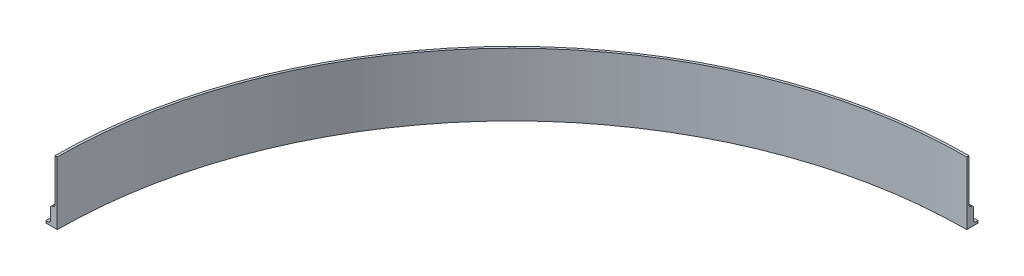
ISO-10303-21;
HEADER;
FILE_DESCRIPTION(('STEP AP214'),'2;1');
FILE_NAME('part.step','',(''),(''),'','','');
FILE_SCHEMA(('AUTOMOTIVE_DESIGN { 1 0 10303 214 1 1 1 1 }'));
ENDSEC;
DATA;
#1=APPLICATION_CONTEXT('core data for automotive mechanical design processes');
#2=APPLICATION_PROTOCOL_DEFINITION('international standard','automotive_design',2000,#1);
#3=PRODUCT_CONTEXT('',#1,'mechanical');
#4=PRODUCT('Part','Part','',(#3));
#5=PRODUCT_RELATED_PRODUCT_CATEGORY('part','',(#4));
#6=PRODUCT_DEFINITION_FORMATION('','',#4);
#7=PRODUCT_DEFINITION_CONTEXT('part definition',#1,'design');
#8=PRODUCT_DEFINITION('design','',#6,#7);
#9=PRODUCT_DEFINITION_SHAPE('','',#8);
#10=(LENGTH_UNIT() NAMED_UNIT(*) SI_UNIT(.MILLI.,.METRE.));
#11=(NAMED_UNIT(*) PLANE_ANGLE_UNIT() SI_UNIT($,.RADIAN.));
#12=(NAMED_UNIT(*) SI_UNIT($,.STERADIAN.) SOLID_ANGLE_UNIT());
#13=UNCERTAINTY_MEASURE_WITH_UNIT(LENGTH_MEASURE(1.E-05),#10,'distance_accuracy_value','');
#14=(GEOMETRIC_REPRESENTATION_CONTEXT(3) GLOBAL_UNCERTAINTY_ASSIGNED_CONTEXT((#13)) GLOBAL_UNIT_ASSIGNED_CONTEXT((#10,
#11,#12)) REPRESENTATION_CONTEXT('',''));
#15=CARTESIAN_POINT('',(0.,0.,0.));
#16=DIRECTION('',(0.,0.,1.));
#17=DIRECTION('',(1.,0.,0.));
#18=AXIS2_PLACEMENT_3D('',#15,#16,#17);
#19=CARTESIAN_POINT('',(1036.,5.,0.));
#20=DIRECTION('',(0.,-1.,0.));
#21=DIRECTION('',(0.,0.,-1.));
#22=AXIS2_PLACEMENT_3D('',#19,#20,#21);
#23=CYLINDRICAL_SURFACE('',#22,1036.);
#24=CARTESIAN_POINT('',(1036.,0.,0.));
#25=DIRECTION('',(0.,1.,0.));
#26=DIRECTION('',(0.,0.,-1.));
#27=AXIS2_PLACEMENT_3D('',#24,#25,#26);
#28=CIRCLE('',#27,1036.);
#29=CARTESIAN_POINT('',(1036.,0.,-1036.));
#30=VERTEX_POINT('',#29);
#31=CARTESIAN_POINT('',(0.,0.,0.));
#32=VERTEX_POINT('',#31);
#33=EDGE_CURVE('E152',#30,#32,#28,.T.);
#34=ORIENTED_EDGE('',*,*,#33,.T.);
#35=DIRECTION('',(0.,-1.,0.));
#36=VECTOR('',#35,1.);
#37=CARTESIAN_POINT('',(0.,5.,0.));
#38=LINE('',#37,#36);
#39=CARTESIAN_POINT('',(0.,5.,0.));
#40=VERTEX_POINT('',#39);
#41=EDGE_CURVE('E170',#40,#32,#38,.T.);
#42=ORIENTED_EDGE('',*,*,#41,.F.);
#43=CARTESIAN_POINT('',(1036.,5.,0.));
#44=DIRECTION('',(0.,1.,0.));
#45=DIRECTION('',(0.,0.,-1.));
#46=AXIS2_PLACEMENT_3D('',#43,#44,#45);
#47=CIRCLE('',#46,1036.);
#48=CARTESIAN_POINT('',(1036.,5.,-1036.));
#49=VERTEX_POINT('',#48);
#50=EDGE_CURVE('E153',#49,#40,#47,.T.);
#51=ORIENTED_EDGE('',*,*,#50,.F.);
#52=DIRECTION('',(0.,-1.,0.));
#53=VECTOR('',#52,1.);
#54=CARTESIAN_POINT('',(1036.,5.,-1036.));
#55=LINE('',#54,#53);
#56=EDGE_CURVE('E122',#49,#30,#55,.T.);
#57=ORIENTED_EDGE('',*,*,#56,.T.);
#58=EDGE_LOOP('',(#34,#42,#51,#57));
#59=FACE_BOUND('',#58,.T.);
#60=ADVANCED_FACE('F33',(#59),#23,.T.);
#61=CARTESIAN_POINT('',(0.,5.,0.));
#62=DIRECTION('',(0.,0.,-1.));
#63=DIRECTION('',(-1.,0.,0.));
#64=AXIS2_PLACEMENT_3D('',#61,#62,#63);
#65=PLANE('',#64);
#66=DIRECTION('',(0.,-1.,0.));
#67=VECTOR('',#66,1.);
#68=CARTESIAN_POINT('',(20.,140.,-1.86636172190057E-13));
#69=LINE('',#68,#67);
#70=CARTESIAN_POINT('',(20.,140.,-1.86636172190057E-13));
#71=VERTEX_POINT('',#70);
#72=CARTESIAN_POINT('',(20.,45.,-1.86636172190057E-13));
#73=VERTEX_POINT('',#72);
#74=EDGE_CURVE('E142',#71,#73,#69,.T.);
#75=ORIENTED_EDGE('',*,*,#74,.T.);
#76=CARTESIAN_POINT('',(15.0000000000001,45.,0.));
#77=DIRECTION('',(0.,0.,-1.));
#78=DIRECTION('',(-1.,0.,0.));
#79=AXIS2_PLACEMENT_3D('',#76,#77,#78);
#80=CIRCLE('',#79,5.);
#81=CARTESIAN_POINT('',(14.9999999999999,40.,0.));
#82=VERTEX_POINT('',#81);
#83=EDGE_CURVE('E185',#73,#82,#80,.T.);
#84=ORIENTED_EDGE('',*,*,#83,.T.);
#85=CARTESIAN_POINT('',(14.9999999999999,35.,0.));
#86=DIRECTION('',(0.,0.,-1.));
#87=DIRECTION('',(-1.,0.,0.));
#88=AXIS2_PLACEMENT_3D('',#85,#86,#87);
#89=CIRCLE('',#88,5.);
#90=CARTESIAN_POINT('',(10.,35.,-1.88473142388778E-13));
#91=VERTEX_POINT('',#90);
#92=EDGE_CURVE('E176',#82,#91,#89,.F.);
#93=ORIENTED_EDGE('',*,*,#92,.T.);
#94=DIRECTION('',(0.,-1.,0.));
#95=VECTOR('',#94,1.);
#96=CARTESIAN_POINT('',(10.,40.,-1.88473142388778E-13));
#97=LINE('',#96,#95);
#98=CARTESIAN_POINT('',(10.,10.,-1.88473142388778E-13));
#99=VERTEX_POINT('',#98);
#100=EDGE_CURVE('E146',#91,#99,#97,.T.);
#101=ORIENTED_EDGE('',*,*,#100,.T.);
#102=CARTESIAN_POINT('',(5.00000000000012,10.,0.));
#103=DIRECTION('',(0.,0.,-1.));
#104=DIRECTION('',(-1.,0.,0.));
#105=AXIS2_PLACEMENT_3D('',#102,#103,#104);
#106=CIRCLE('',#105,5.);
#107=CARTESIAN_POINT('',(5.00000000000012,5.,0.));
#108=VERTEX_POINT('',#107);
#109=EDGE_CURVE('E42',#99,#108,#106,.T.);
#110=ORIENTED_EDGE('',*,*,#109,.T.);
#111=DIRECTION('',(1.,0.,0.));
#112=VECTOR('',#111,1.);
#113=CARTESIAN_POINT('',(0.,5.,0.));
#114=LINE('',#113,#112);
#115=EDGE_CURVE('E156',#40,#108,#114,.T.);
#116=ORIENTED_EDGE('',*,*,#115,.F.);
#117=ORIENTED_EDGE('',*,*,#41,.T.);
#118=DIRECTION('',(1.,0.,0.));
#119=VECTOR('',#118,1.);
#120=CARTESIAN_POINT('',(0.,0.,0.));
#121=LINE('',#120,#119);
#122=CARTESIAN_POINT('',(24.9999999999999,0.,0.));
#123=VERTEX_POINT('',#122);
#124=EDGE_CURVE('E163',#32,#123,#121,.T.);
#125=ORIENTED_EDGE('',*,*,#124,.T.);
#126=DIRECTION('',(0.,-1.,0.));
#127=VECTOR('',#126,1.);
#128=CARTESIAN_POINT('',(24.9999999999999,5.,0.));
#129=LINE('',#128,#127);
#130=CARTESIAN_POINT('',(24.9999999999999,140.,0.));
#131=VERTEX_POINT('',#130);
#132=EDGE_CURVE('E121',#131,#123,#129,.T.);
#133=ORIENTED_EDGE('',*,*,#132,.F.);
#134=DIRECTION('',(1.,0.,0.));
#135=VECTOR('',#134,1.);
#136=CARTESIAN_POINT('',(20.,140.,-1.24424114793371E-13));
#137=LINE('',#136,#135);
#138=EDGE_CURVE('E136',#71,#131,#137,.T.);
#139=ORIENTED_EDGE('',*,*,#138,.F.);
#140=EDGE_LOOP('',(#75,#84,#93,#101,#110,#116,#117,#125,#133,#139));
#141=FACE_BOUND('',#140,.T.);
#142=ADVANCED_FACE('F190',(#141),#65,.F.);
#143=CARTESIAN_POINT('',(1036.,5.,0.));
#144=DIRECTION('',(0.,-1.,0.));
#145=DIRECTION('',(0.,0.,-1.));
#146=AXIS2_PLACEMENT_3D('',#143,#144,#145);
#147=CYLINDRICAL_SURFACE('',#146,1011.);
#148=CARTESIAN_POINT('',(1036.,0.,0.));
#149=DIRECTION('',(0.,-1.,0.));
#150=DIRECTION('',(0.,0.,-1.));
#151=AXIS2_PLACEMENT_3D('',#148,#149,#150);
#152=CIRCLE('',#151,1011.);
#153=CARTESIAN_POINT('',(1036.,0.,-1011.));
#154=VERTEX_POINT('',#153);
#155=EDGE_CURVE('E119',#123,#154,#152,.T.);
#156=ORIENTED_EDGE('',*,*,#155,.T.);
#157=DIRECTION('',(0.,-1.,0.));
#158=VECTOR('',#157,1.);
#159=CARTESIAN_POINT('',(1036.,5.,-1011.));
#160=LINE('',#159,#158);
#161=CARTESIAN_POINT('',(1036.,140.,-1011.));
#162=VERTEX_POINT('',#161);
#163=EDGE_CURVE('E112',#162,#154,#160,.T.);
#164=ORIENTED_EDGE('',*,*,#163,.F.);
#165=CARTESIAN_POINT('',(1036.,140.,0.));
#166=DIRECTION('',(0.,-1.,0.));
#167=DIRECTION('',(0.,0.,1.));
#168=AXIS2_PLACEMENT_3D('',#165,#166,#167);
#169=CIRCLE('',#168,1011.);
#170=EDGE_CURVE('E117',#131,#162,#169,.T.);
#171=ORIENTED_EDGE('',*,*,#170,.F.);
#172=ORIENTED_EDGE('',*,*,#132,.T.);
#173=EDGE_LOOP('',(#156,#164,#171,#172));
#174=FACE_BOUND('',#173,.T.);
#175=ADVANCED_FACE('F114',(#174),#147,.F.);
#176=CARTESIAN_POINT('',(1036.,5.,-1036.));
#177=DIRECTION('',(-1.,0.,0.));
#178=DIRECTION('',(0.,0.,1.));
#179=AXIS2_PLACEMENT_3D('',#176,#177,#178);
#180=PLANE('',#179);
#181=DIRECTION('',(0.,-1.,0.));
#182=VECTOR('',#181,1.);
#183=CARTESIAN_POINT('',(1036.,40.,-1026.));
#184=LINE('',#183,#182);
#185=CARTESIAN_POINT('',(1036.,35.,-1026.));
#186=VERTEX_POINT('',#185);
#187=CARTESIAN_POINT('',(1036.,10.,-1026.));
#188=VERTEX_POINT('',#187);
#189=EDGE_CURVE('E149',#186,#188,#184,.T.);
#190=ORIENTED_EDGE('',*,*,#189,.F.);
#191=CARTESIAN_POINT('',(1035.99999999999,35.,-1021.));
#192=DIRECTION('',(-1.,0.,0.));
#193=DIRECTION('',(0.,0.,1.));
#194=AXIS2_PLACEMENT_3D('',#191,#192,#193);
#195=CIRCLE('',#194,5.);
#196=CARTESIAN_POINT('',(1036.,40.,-1021.));
#197=VERTEX_POINT('',#196);
#198=EDGE_CURVE('E49',#186,#197,#195,.F.);
#199=ORIENTED_EDGE('',*,*,#198,.T.);
#200=CARTESIAN_POINT('',(1035.99999999999,45.,-1021.));
#201=DIRECTION('',(-1.,0.,0.));
#202=DIRECTION('',(0.,0.,1.));
#203=AXIS2_PLACEMENT_3D('',#200,#201,#202);
#204=CIRCLE('',#203,5.);
#205=CARTESIAN_POINT('',(1036.,45.,-1016.));
#206=VERTEX_POINT('',#205);
#207=EDGE_CURVE('E187',#197,#206,#204,.T.);
#208=ORIENTED_EDGE('',*,*,#207,.T.);
#209=DIRECTION('',(0.,-1.,0.));
#210=VECTOR('',#209,1.);
#211=CARTESIAN_POINT('',(1036.,140.,-1016.));
#212=LINE('',#211,#210);
#213=CARTESIAN_POINT('',(1036.,140.,-1016.));
#214=VERTEX_POINT('',#213);
#215=EDGE_CURVE('E128',#214,#206,#212,.T.);
#216=ORIENTED_EDGE('',*,*,#215,.F.);
#217=DIRECTION('',(0.,0.,-1.));
#218=VECTOR('',#217,1.);
#219=CARTESIAN_POINT('',(1036.,140.,-1016.));
#220=LINE('',#219,#218);
#221=EDGE_CURVE('E125',#162,#214,#220,.T.);
#222=ORIENTED_EDGE('',*,*,#221,.F.);
#223=ORIENTED_EDGE('',*,*,#163,.T.);
#224=DIRECTION('',(0.,0.,-1.));
#225=VECTOR('',#224,1.);
#226=CARTESIAN_POINT('',(1036.,0.,-1036.));
#227=LINE('',#226,#225);
#228=EDGE_CURVE('E157',#154,#30,#227,.T.);
#229=ORIENTED_EDGE('',*,*,#228,.T.);
#230=ORIENTED_EDGE('',*,*,#56,.F.);
#231=DIRECTION('',(0.,0.,-1.));
#232=VECTOR('',#231,1.);
#233=CARTESIAN_POINT('',(1036.,5.,-1036.));
#234=LINE('',#233,#232);
#235=CARTESIAN_POINT('',(1036.,5.,-1031.));
#236=VERTEX_POINT('',#235);
#237=EDGE_CURVE('E159',#236,#49,#234,.T.);
#238=ORIENTED_EDGE('',*,*,#237,.F.);
#239=CARTESIAN_POINT('',(1035.99999999999,10.,-1031.));
#240=DIRECTION('',(-1.,0.,0.));
#241=DIRECTION('',(0.,0.,1.));
#242=AXIS2_PLACEMENT_3D('',#239,#240,#241);
#243=CIRCLE('',#242,5.);
#244=EDGE_CURVE('E11',#236,#188,#243,.T.);
#245=ORIENTED_EDGE('',*,*,#244,.T.);
#246=EDGE_LOOP('',(#190,#199,#208,#216,#222,#223,#229,#230,#238,#245));
#247=FACE_BOUND('',#246,.T.);
#248=ADVANCED_FACE('F126',(#247),#180,.F.);
#249=CARTESIAN_POINT('',(1036.,5.,0.));
#250=DIRECTION('',(0.,-1.,0.));
#251=DIRECTION('',(0.,0.,-1.));
#252=AXIS2_PLACEMENT_3D('',#249,#250,#251);
#253=PLANE('',#252);
#254=ORIENTED_EDGE('',*,*,#115,.T.);
#255=CARTESIAN_POINT('',(1036.,5.,0.));
#256=DIRECTION('',(0.,-1.,0.));
#257=DIRECTION('',(0.,0.,-1.));
#258=AXIS2_PLACEMENT_3D('',#255,#256,#257);
#259=CIRCLE('',#258,1031.);
#260=EDGE_CURVE('E57',#108,#236,#259,.T.);
#261=ORIENTED_EDGE('',*,*,#260,.T.);
#262=ORIENTED_EDGE('',*,*,#237,.T.);
#263=ORIENTED_EDGE('',*,*,#50,.T.);
#264=EDGE_LOOP('',(#254,#261,#262,#263));
#265=FACE_BOUND('',#264,.T.);
#266=ADVANCED_FACE('F194',(#265),#253,.F.);
#267=CARTESIAN_POINT('',(1036.,0.,0.));
#268=DIRECTION('',(0.,-1.,0.));
#269=DIRECTION('',(0.,0.,-1.));
#270=AXIS2_PLACEMENT_3D('',#267,#268,#269);
#271=PLANE('',#270);
#272=ORIENTED_EDGE('',*,*,#33,.F.);
#273=ORIENTED_EDGE('',*,*,#228,.F.);
#274=ORIENTED_EDGE('',*,*,#155,.F.);
#275=ORIENTED_EDGE('',*,*,#124,.F.);
#276=EDGE_LOOP('',(#272,#273,#274,#275));
#277=FACE_BOUND('',#276,.T.);
#278=ADVANCED_FACE('F214',(#277),#271,.T.);
#279=CARTESIAN_POINT('',(1036.,40.,0.));
#280=DIRECTION('',(0.,-1.,0.));
#281=DIRECTION('',(0.,0.,-1.));
#282=AXIS2_PLACEMENT_3D('',#279,#280,#281);
#283=CYLINDRICAL_SURFACE('',#282,1026.);
#284=ORIENTED_EDGE('',*,*,#100,.F.);
#285=CARTESIAN_POINT('',(1036.,35.,0.));
#286=DIRECTION('',(0.,1.,0.));
#287=DIRECTION('',(0.,0.,1.));
#288=AXIS2_PLACEMENT_3D('',#285,#286,#287);
#289=CIRCLE('',#288,1026.);
#290=EDGE_CURVE('E181',#91,#186,#289,.F.);
#291=ORIENTED_EDGE('',*,*,#290,.T.);
#292=ORIENTED_EDGE('',*,*,#189,.T.);
#293=CARTESIAN_POINT('',(1036.,10.,0.));
#294=DIRECTION('',(0.,-1.,0.));
#295=DIRECTION('',(0.,0.,-1.));
#296=AXIS2_PLACEMENT_3D('',#293,#294,#295);
#297=CIRCLE('',#296,1026.);
#298=EDGE_CURVE('E178',#188,#99,#297,.F.);
#299=ORIENTED_EDGE('',*,*,#298,.T.);
#300=EDGE_LOOP('',(#284,#291,#292,#299));
#301=FACE_BOUND('',#300,.T.);
#302=ADVANCED_FACE('F200',(#301),#283,.T.);
#303=CARTESIAN_POINT('',(1036.,140.,0.));
#304=DIRECTION('',(0.,-1.,0.));
#305=DIRECTION('',(0.,0.,-1.));
#306=AXIS2_PLACEMENT_3D('',#303,#304,#305);
#307=CYLINDRICAL_SURFACE('',#306,1016.);
#308=ORIENTED_EDGE('',*,*,#215,.T.);
#309=CARTESIAN_POINT('',(1036.,45.,0.));
#310=DIRECTION('',(0.,1.,0.));
#311=DIRECTION('',(0.,0.,1.));
#312=AXIS2_PLACEMENT_3D('',#309,#310,#311);
#313=CIRCLE('',#312,1016.);
#314=EDGE_CURVE('E173',#206,#73,#313,.T.);
#315=ORIENTED_EDGE('',*,*,#314,.T.);
#316=ORIENTED_EDGE('',*,*,#74,.F.);
#317=CARTESIAN_POINT('',(1036.,140.,0.));
#318=DIRECTION('',(0.,1.,0.));
#319=DIRECTION('',(0.,0.,1.));
#320=AXIS2_PLACEMENT_3D('',#317,#318,#319);
#321=CIRCLE('',#320,1016.);
#322=EDGE_CURVE('E131',#214,#71,#321,.T.);
#323=ORIENTED_EDGE('',*,*,#322,.F.);
#324=EDGE_LOOP('',(#308,#315,#316,#323));
#325=FACE_BOUND('',#324,.T.);
#326=ADVANCED_FACE('F210',(#325),#307,.T.);
#327=CARTESIAN_POINT('',(1036.,140.,0.));
#328=DIRECTION('',(0.,1.,0.));
#329=DIRECTION('',(0.,0.,1.));
#330=AXIS2_PLACEMENT_3D('',#327,#328,#329);
#331=PLANE('',#330);
#332=ORIENTED_EDGE('',*,*,#170,.T.);
#333=ORIENTED_EDGE('',*,*,#221,.T.);
#334=ORIENTED_EDGE('',*,*,#322,.T.);
#335=ORIENTED_EDGE('',*,*,#138,.T.);
#336=EDGE_LOOP('',(#332,#333,#334,#335));
#337=FACE_BOUND('',#336,.T.);
#338=ADVANCED_FACE('F134',(#337),#331,.T.);
#339=CARTESIAN_POINT('',(1036.,35.,0.));
#340=DIRECTION('',(0.,1.,0.));
#341=DIRECTION('',(0.,0.,1.));
#342=AXIS2_PLACEMENT_3D('',#339,#340,#341);
#343=TOROIDAL_SURFACE('',#342,1021.,5.);
#344=CARTESIAN_POINT('',(1036.,40.,0.));
#345=DIRECTION('',(0.,1.,0.));
#346=DIRECTION('',(0.,0.,1.));
#347=AXIS2_PLACEMENT_3D('',#344,#345,#346);
#348=CIRCLE('',#347,1021.);
#349=EDGE_CURVE('E37',#197,#82,#348,.T.);
#350=ORIENTED_EDGE('',*,*,#349,.F.);
#351=ORIENTED_EDGE('',*,*,#198,.F.);
#352=ORIENTED_EDGE('',*,*,#290,.F.);
#353=ORIENTED_EDGE('',*,*,#92,.F.);
#354=EDGE_LOOP('',(#350,#351,#352,#353));
#355=FACE_BOUND('',#354,.T.);
#356=ADVANCED_FACE('F204',(#355),#343,.T.);
#357=CARTESIAN_POINT('',(1036.,45.,0.));
#358=DIRECTION('',(0.,1.,0.));
#359=DIRECTION('',(0.,0.,1.));
#360=AXIS2_PLACEMENT_3D('',#357,#358,#359);
#361=TOROIDAL_SURFACE('',#360,1021.,5.);
#362=ORIENTED_EDGE('',*,*,#207,.F.);
#363=ORIENTED_EDGE('',*,*,#349,.T.);
#364=ORIENTED_EDGE('',*,*,#83,.F.);
#365=ORIENTED_EDGE('',*,*,#314,.F.);
#366=EDGE_LOOP('',(#362,#363,#364,#365));
#367=FACE_BOUND('',#366,.T.);
#368=ADVANCED_FACE('F208',(#367),#361,.F.);
#369=CARTESIAN_POINT('',(1036.,10.,0.));
#370=DIRECTION('',(0.,-1.,0.));
#371=DIRECTION('',(0.,0.,-1.));
#372=AXIS2_PLACEMENT_3D('',#369,#370,#371);
#373=TOROIDAL_SURFACE('',#372,1031.,5.);
#374=ORIENTED_EDGE('',*,*,#244,.F.);
#375=ORIENTED_EDGE('',*,*,#260,.F.);
#376=ORIENTED_EDGE('',*,*,#109,.F.);
#377=ORIENTED_EDGE('',*,*,#298,.F.);
#378=EDGE_LOOP('',(#374,#375,#376,#377));
#379=FACE_BOUND('',#378,.T.);
#380=ADVANCED_FACE('F35',(#379),#373,.F.);
#381=CLOSED_SHELL('',(#60,#142,#175,#248,#266,#278,#302,#326,#338,#356,#368,#380));
#382=MANIFOLD_SOLID_BREP('B2',#381);
#383=ADVANCED_BREP_SHAPE_REPRESENTATION('',(#18,#382),#14);
#384=SHAPE_DEFINITION_REPRESENTATION(#9,#383);
ENDSEC;
END-ISO-10303-21;
